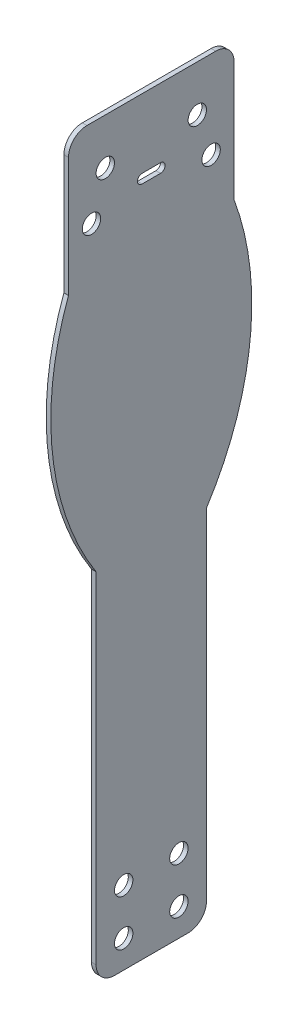
ISO-10303-21;
HEADER;
FILE_DESCRIPTION(('STEP AP214'),'2;1');
FILE_NAME('part.step','',(''),(''),'','','');
FILE_SCHEMA(('AUTOMOTIVE_DESIGN { 1 0 10303 214 1 1 1 1 }'));
ENDSEC;
DATA;
#1=APPLICATION_CONTEXT('core data for automotive mechanical design processes');
#2=APPLICATION_PROTOCOL_DEFINITION('international standard','automotive_design',2000,#1);
#3=PRODUCT_CONTEXT('',#1,'mechanical');
#4=PRODUCT('Part','Part','',(#3));
#5=PRODUCT_RELATED_PRODUCT_CATEGORY('part','',(#4));
#6=PRODUCT_DEFINITION_FORMATION('','',#4);
#7=PRODUCT_DEFINITION_CONTEXT('part definition',#1,'design');
#8=PRODUCT_DEFINITION('design','',#6,#7);
#9=PRODUCT_DEFINITION_SHAPE('','',#8);
#10=(LENGTH_UNIT() NAMED_UNIT(*) SI_UNIT(.MILLI.,.METRE.));
#11=(NAMED_UNIT(*) PLANE_ANGLE_UNIT() SI_UNIT($,.RADIAN.));
#12=(NAMED_UNIT(*) SI_UNIT($,.STERADIAN.) SOLID_ANGLE_UNIT());
#13=UNCERTAINTY_MEASURE_WITH_UNIT(LENGTH_MEASURE(1.E-05),#10,'distance_accuracy_value','');
#14=(GEOMETRIC_REPRESENTATION_CONTEXT(3) GLOBAL_UNCERTAINTY_ASSIGNED_CONTEXT((#13)) GLOBAL_UNIT_ASSIGNED_CONTEXT((#10,
#11,#12)) REPRESENTATION_CONTEXT('',''));
#15=CARTESIAN_POINT('',(0.,0.,0.));
#16=DIRECTION('',(0.,0.,1.));
#17=DIRECTION('',(1.,0.,0.));
#18=AXIS2_PLACEMENT_3D('',#15,#16,#17);
#19=CARTESIAN_POINT('',(0.,-51.4826288706178,-40.1592353526703));
#20=DIRECTION('',(1.,0.,0.));
#21=DIRECTION('',(0.,0.,-1.));
#22=AXIS2_PLACEMENT_3D('',#19,#20,#21);
#23=PLANE('',#22);
#24=CARTESIAN_POINT('',(0.,-147.,-6.00000000000002));
#25=DIRECTION('',(1.,0.,0.));
#26=DIRECTION('',(0.,0.,-1.));
#27=AXIS2_PLACEMENT_3D('',#24,#25,#26);
#28=CIRCLE('',#27,2.);
#29=CARTESIAN_POINT('',(0.,-147.,-8.00000000000002));
#30=VERTEX_POINT('',#29);
#31=EDGE_CURVE('E630',#30,#30,#28,.T.);
#32=ORIENTED_EDGE('',*,*,#31,.T.);
#33=EDGE_LOOP('',(#32));
#34=FACE_BOUND('',#33,.T.);
#35=CARTESIAN_POINT('',(0.,-147.,5.99999999999998));
#36=DIRECTION('',(1.,0.,0.));
#37=DIRECTION('',(0.,0.,-1.));
#38=AXIS2_PLACEMENT_3D('',#35,#36,#37);
#39=CIRCLE('',#38,2.);
#40=CARTESIAN_POINT('',(0.,-147.,3.99999999999998));
#41=VERTEX_POINT('',#40);
#42=EDGE_CURVE('E626',#41,#41,#39,.T.);
#43=ORIENTED_EDGE('',*,*,#42,.T.);
#44=EDGE_LOOP('',(#43));
#45=FACE_BOUND('',#44,.T.);
#46=CARTESIAN_POINT('',(0.,-157.,5.99999999999998));
#47=DIRECTION('',(1.,0.,0.));
#48=DIRECTION('',(0.,0.,-1.));
#49=AXIS2_PLACEMENT_3D('',#46,#47,#48);
#50=CIRCLE('',#49,2.);
#51=CARTESIAN_POINT('',(0.,-157.,3.99999999999998));
#52=VERTEX_POINT('',#51);
#53=EDGE_CURVE('E619',#52,#52,#50,.T.);
#54=ORIENTED_EDGE('',*,*,#53,.T.);
#55=EDGE_LOOP('',(#54));
#56=FACE_BOUND('',#55,.T.);
#57=CARTESIAN_POINT('',(0.,-157.,-6.00000000000002));
#58=DIRECTION('',(1.,0.,0.));
#59=DIRECTION('',(0.,0.,-1.));
#60=AXIS2_PLACEMENT_3D('',#57,#58,#59);
#61=CIRCLE('',#60,2.);
#62=CARTESIAN_POINT('',(0.,-157.,-8.00000000000002));
#63=VERTEX_POINT('',#62);
#64=EDGE_CURVE('E181',#63,#63,#61,.T.);
#65=ORIENTED_EDGE('',*,*,#64,.T.);
#66=EDGE_LOOP('',(#65));
#67=FACE_BOUND('',#66,.T.);
#68=DIRECTION('',(0.,0.,1.));
#69=VECTOR('',#68,1.);
#70=CARTESIAN_POINT('',(0.,-15.,2.));
#71=LINE('',#70,#69);
#72=CARTESIAN_POINT('',(0.,-15.,-2.));
#73=VERTEX_POINT('',#72);
#74=CARTESIAN_POINT('',(0.,-15.,2.));
#75=VERTEX_POINT('',#74);
#76=EDGE_CURVE('E163',#73,#75,#71,.T.);
#77=ORIENTED_EDGE('',*,*,#76,.T.);
#78=CARTESIAN_POINT('',(0.,-16.,2.));
#79=DIRECTION('',(1.,0.,0.));
#80=DIRECTION('',(0.,0.,-1.));
#81=AXIS2_PLACEMENT_3D('',#78,#79,#80);
#82=CIRCLE('',#81,1.);
#83=CARTESIAN_POINT('',(0.,-17.,2.));
#84=VERTEX_POINT('',#83);
#85=EDGE_CURVE('E155',#75,#84,#82,.T.);
#86=ORIENTED_EDGE('',*,*,#85,.T.);
#87=DIRECTION('',(0.,0.,-1.));
#88=VECTOR('',#87,1.);
#89=CARTESIAN_POINT('',(0.,-17.,2.));
#90=LINE('',#89,#88);
#91=CARTESIAN_POINT('',(0.,-17.,-2.));
#92=VERTEX_POINT('',#91);
#93=EDGE_CURVE('E167',#84,#92,#90,.T.);
#94=ORIENTED_EDGE('',*,*,#93,.T.);
#95=CARTESIAN_POINT('',(0.,-16.,-2.));
#96=DIRECTION('',(1.,0.,0.));
#97=DIRECTION('',(0.,0.,-1.));
#98=AXIS2_PLACEMENT_3D('',#95,#96,#97);
#99=CIRCLE('',#98,1.);
#100=EDGE_CURVE('E171',#92,#73,#99,.T.);
#101=ORIENTED_EDGE('',*,*,#100,.T.);
#102=EDGE_LOOP('',(#77,#86,#94,#101));
#103=FACE_BOUND('',#102,.T.);
#104=CARTESIAN_POINT('',(0.,-19.,13.));
#105=DIRECTION('',(-1.,0.,0.));
#106=DIRECTION('',(0.,0.,1.));
#107=AXIS2_PLACEMENT_3D('',#104,#105,#106);
#108=CIRCLE('',#107,2.);
#109=CARTESIAN_POINT('',(0.,-19.,15.));
#110=VERTEX_POINT('',#109);
#111=EDGE_CURVE('E202',#110,#110,#108,.T.);
#112=ORIENTED_EDGE('',*,*,#111,.F.);
#113=EDGE_LOOP('',(#112));
#114=FACE_BOUND('',#113,.T.);
#115=CARTESIAN_POINT('',(0.,-10.,10.));
#116=DIRECTION('',(-1.,0.,0.));
#117=DIRECTION('',(0.,0.,1.));
#118=AXIS2_PLACEMENT_3D('',#115,#116,#117);
#119=CIRCLE('',#118,2.);
#120=CARTESIAN_POINT('',(0.,-10.,12.));
#121=VERTEX_POINT('',#120);
#122=EDGE_CURVE('E208',#121,#121,#119,.T.);
#123=ORIENTED_EDGE('',*,*,#122,.F.);
#124=EDGE_LOOP('',(#123));
#125=FACE_BOUND('',#124,.T.);
#126=CARTESIAN_POINT('',(0.,-10.,-10.));
#127=DIRECTION('',(-1.,0.,0.));
#128=DIRECTION('',(0.,0.,1.));
#129=AXIS2_PLACEMENT_3D('',#126,#127,#128);
#130=CIRCLE('',#129,2.);
#131=CARTESIAN_POINT('',(0.,-10.,-8.));
#132=VERTEX_POINT('',#131);
#133=EDGE_CURVE('E214',#132,#132,#130,.T.);
#134=ORIENTED_EDGE('',*,*,#133,.F.);
#135=EDGE_LOOP('',(#134));
#136=FACE_BOUND('',#135,.T.);
#137=DIRECTION('',(0.,-1.,0.));
#138=VECTOR('',#137,1.);
#139=CARTESIAN_POINT('',(0.,0.,18.));
#140=LINE('',#139,#138);
#141=CARTESIAN_POINT('',(0.,-3.99999999999999,18.));
#142=VERTEX_POINT('',#141);
#143=CARTESIAN_POINT('',(0.,-30.,18.));
#144=VERTEX_POINT('',#143);
#145=EDGE_CURVE('E220',#142,#144,#140,.T.);
#146=ORIENTED_EDGE('',*,*,#145,.F.);
#147=CARTESIAN_POINT('',(0.,-4.,14.));
#148=DIRECTION('',(1.,0.,0.));
#149=DIRECTION('',(0.,0.,-1.));
#150=AXIS2_PLACEMENT_3D('',#147,#148,#149);
#151=CIRCLE('',#150,4.);
#152=CARTESIAN_POINT('',(0.,0.,14.));
#153=VERTEX_POINT('',#152);
#154=EDGE_CURVE('E281',#142,#153,#151,.F.);
#155=ORIENTED_EDGE('',*,*,#154,.T.);
#156=DIRECTION('',(0.,0.,-1.));
#157=VECTOR('',#156,1.);
#158=CARTESIAN_POINT('',(0.,0.,18.));
#159=LINE('',#158,#157);
#160=CARTESIAN_POINT('',(0.,0.,-14.));
#161=VERTEX_POINT('',#160);
#162=EDGE_CURVE('E224',#153,#161,#159,.T.);
#163=ORIENTED_EDGE('',*,*,#162,.T.);
#164=CARTESIAN_POINT('',(0.,-3.99999999999999,-14.));
#165=DIRECTION('',(1.,0.,0.));
#166=DIRECTION('',(0.,0.,-1.));
#167=AXIS2_PLACEMENT_3D('',#164,#165,#166);
#168=CIRCLE('',#167,4.);
#169=CARTESIAN_POINT('',(0.,-4.,-18.));
#170=VERTEX_POINT('',#169);
#171=EDGE_CURVE('E279',#161,#170,#168,.F.);
#172=ORIENTED_EDGE('',*,*,#171,.T.);
#173=DIRECTION('',(0.,-1.,0.));
#174=VECTOR('',#173,1.);
#175=CARTESIAN_POINT('',(0.,0.,-18.));
#176=LINE('',#175,#174);
#177=CARTESIAN_POINT('',(0.,-30.,-18.));
#178=VERTEX_POINT('',#177);
#179=EDGE_CURVE('E257',#170,#178,#176,.T.);
#180=ORIENTED_EDGE('',*,*,#179,.T.);
#181=CARTESIAN_POINT('',(0.,-51.4826288706178,40.1592353526703));
#182=DIRECTION('',(-1.,0.,0.));
#183=DIRECTION('',(0.,0.,1.));
#184=AXIS2_PLACEMENT_3D('',#181,#182,#183);
#185=CIRCLE('',#184,62.);
#186=CARTESIAN_POINT('',(0.,-85.,-12.));
#187=VERTEX_POINT('',#186);
#188=EDGE_CURVE('E254',#178,#187,#185,.T.);
#189=ORIENTED_EDGE('',*,*,#188,.T.);
#190=DIRECTION('',(0.,1.,0.));
#191=VECTOR('',#190,1.);
#192=CARTESIAN_POINT('',(0.,-163.,-12.));
#193=LINE('',#192,#191);
#194=CARTESIAN_POINT('',(0.,-159.,-12.));
#195=VERTEX_POINT('',#194);
#196=EDGE_CURVE('E252',#195,#187,#193,.T.);
#197=ORIENTED_EDGE('',*,*,#196,.F.);
#198=CARTESIAN_POINT('',(0.,-159.,-8.));
#199=DIRECTION('',(1.,0.,0.));
#200=DIRECTION('',(0.,0.,-1.));
#201=AXIS2_PLACEMENT_3D('',#198,#199,#200);
#202=CIRCLE('',#201,4.);
#203=CARTESIAN_POINT('',(0.,-163.,-8.));
#204=VERTEX_POINT('',#203);
#205=EDGE_CURVE('E277',#195,#204,#202,.F.);
#206=ORIENTED_EDGE('',*,*,#205,.T.);
#207=DIRECTION('',(0.,0.,1.));
#208=VECTOR('',#207,1.);
#209=CARTESIAN_POINT('',(0.,-163.,-12.));
#210=LINE('',#209,#208);
#211=CARTESIAN_POINT('',(0.,-163.,8.));
#212=VERTEX_POINT('',#211);
#213=EDGE_CURVE('E249',#204,#212,#210,.T.);
#214=ORIENTED_EDGE('',*,*,#213,.T.);
#215=CARTESIAN_POINT('',(0.,-159.,8.));
#216=DIRECTION('',(1.,0.,0.));
#217=DIRECTION('',(0.,0.,-1.));
#218=AXIS2_PLACEMENT_3D('',#215,#216,#217);
#219=CIRCLE('',#218,4.);
#220=CARTESIAN_POINT('',(0.,-159.,12.));
#221=VERTEX_POINT('',#220);
#222=EDGE_CURVE('E275',#212,#221,#219,.F.);
#223=ORIENTED_EDGE('',*,*,#222,.T.);
#224=DIRECTION('',(0.,1.,0.));
#225=VECTOR('',#224,1.);
#226=CARTESIAN_POINT('',(0.,-163.,12.));
#227=LINE('',#226,#225);
#228=CARTESIAN_POINT('',(0.,-85.,12.));
#229=VERTEX_POINT('',#228);
#230=EDGE_CURVE('E247',#221,#229,#227,.T.);
#231=ORIENTED_EDGE('',*,*,#230,.T.);
#232=CARTESIAN_POINT('',(0.,-51.4826288706178,-40.1592353526703));
#233=DIRECTION('',(1.,0.,0.));
#234=DIRECTION('',(0.,0.,-1.));
#235=AXIS2_PLACEMENT_3D('',#232,#233,#234);
#236=CIRCLE('',#235,62.);
#237=EDGE_CURVE('E244',#144,#229,#236,.T.);
#238=ORIENTED_EDGE('',*,*,#237,.F.);
#239=EDGE_LOOP('',(#146,#155,#163,#172,#180,#189,#197,#206,#214,#223,#231,#238));
#240=FACE_BOUND('',#239,.T.);
#241=CARTESIAN_POINT('',(0.,-19.,-13.));
#242=DIRECTION('',(-1.,0.,0.));
#243=DIRECTION('',(0.,0.,1.));
#244=AXIS2_PLACEMENT_3D('',#241,#242,#243);
#245=CIRCLE('',#244,2.);
#246=CARTESIAN_POINT('',(0.,-19.,-11.));
#247=VERTEX_POINT('',#246);
#248=EDGE_CURVE('E193',#247,#247,#245,.T.);
#249=ORIENTED_EDGE('',*,*,#248,.F.);
#250=EDGE_LOOP('',(#249));
#251=FACE_BOUND('',#250,.T.);
#252=ADVANCED_FACE('F37',(#34,#45,#56,#67,#103,#114,#125,#136,#240,#251),#23,.F.);
#253=CARTESIAN_POINT('',(1.,0.,18.));
#254=DIRECTION('',(0.,0.,-1.));
#255=DIRECTION('',(0.,1.,0.));
#256=AXIS2_PLACEMENT_3D('',#253,#254,#255);
#257=PLANE('',#256);
#258=DIRECTION('',(0.,-1.,0.));
#259=VECTOR('',#258,1.);
#260=CARTESIAN_POINT('',(1.,0.,18.));
#261=LINE('',#260,#259);
#262=CARTESIAN_POINT('',(1.,-3.99999999999999,18.));
#263=VERTEX_POINT('',#262);
#264=CARTESIAN_POINT('',(1.,-30.,18.));
#265=VERTEX_POINT('',#264);
#266=EDGE_CURVE('E221',#263,#265,#261,.T.);
#267=ORIENTED_EDGE('',*,*,#266,.F.);
#268=DIRECTION('',(-1.,0.,0.));
#269=VECTOR('',#268,1.);
#270=CARTESIAN_POINT('',(0.,-3.99999999999999,18.));
#271=LINE('',#270,#269);
#272=EDGE_CURVE('E272',#263,#142,#271,.T.);
#273=ORIENTED_EDGE('',*,*,#272,.T.);
#274=ORIENTED_EDGE('',*,*,#145,.T.);
#275=DIRECTION('',(-1.,0.,0.));
#276=VECTOR('',#275,1.);
#277=CARTESIAN_POINT('',(1.,-30.,18.));
#278=LINE('',#277,#276);
#279=EDGE_CURVE('E269',#265,#144,#278,.T.);
#280=ORIENTED_EDGE('',*,*,#279,.F.);
#281=EDGE_LOOP('',(#267,#273,#274,#280));
#282=FACE_BOUND('',#281,.T.);
#283=ADVANCED_FACE('F340',(#282),#257,.F.);
#284=CARTESIAN_POINT('',(1.,-51.4826288706178,-40.1592353526703));
#285=DIRECTION('',(-1.,0.,0.));
#286=DIRECTION('',(0.,0.,1.));
#287=AXIS2_PLACEMENT_3D('',#284,#285,#286);
#288=CYLINDRICAL_SURFACE('',#287,62.);
#289=ORIENTED_EDGE('',*,*,#237,.T.);
#290=DIRECTION('',(-1.,0.,0.));
#291=VECTOR('',#290,1.);
#292=CARTESIAN_POINT('',(1.,-85.,12.));
#293=LINE('',#292,#291);
#294=CARTESIAN_POINT('',(1.,-85.,12.));
#295=VERTEX_POINT('',#294);
#296=EDGE_CURVE('E266',#295,#229,#293,.T.);
#297=ORIENTED_EDGE('',*,*,#296,.F.);
#298=CARTESIAN_POINT('',(1.,-51.4826288706178,-40.1592353526703));
#299=DIRECTION('',(1.,0.,0.));
#300=DIRECTION('',(0.,0.,-1.));
#301=AXIS2_PLACEMENT_3D('',#298,#299,#300);
#302=CIRCLE('',#301,62.);
#303=EDGE_CURVE('E223',#265,#295,#302,.T.);
#304=ORIENTED_EDGE('',*,*,#303,.F.);
#305=ORIENTED_EDGE('',*,*,#279,.T.);
#306=EDGE_LOOP('',(#289,#297,#304,#305));
#307=FACE_BOUND('',#306,.T.);
#308=ADVANCED_FACE('F345',(#307),#288,.T.);
#309=CARTESIAN_POINT('',(1.,-163.,12.));
#310=DIRECTION('',(0.,0.,1.));
#311=DIRECTION('',(1.,0.,0.));
#312=AXIS2_PLACEMENT_3D('',#309,#310,#311);
#313=PLANE('',#312);
#314=ORIENTED_EDGE('',*,*,#230,.F.);
#315=DIRECTION('',(-1.,0.,0.));
#316=VECTOR('',#315,1.);
#317=CARTESIAN_POINT('',(1.,-159.,12.));
#318=LINE('',#317,#316);
#319=CARTESIAN_POINT('',(1.,-159.,12.));
#320=VERTEX_POINT('',#319);
#321=EDGE_CURVE('E11',#221,#320,#318,.F.);
#322=ORIENTED_EDGE('',*,*,#321,.T.);
#323=DIRECTION('',(0.,1.,0.));
#324=VECTOR('',#323,1.);
#325=CARTESIAN_POINT('',(1.,-163.,12.));
#326=LINE('',#325,#324);
#327=EDGE_CURVE('E227',#320,#295,#326,.T.);
#328=ORIENTED_EDGE('',*,*,#327,.T.);
#329=ORIENTED_EDGE('',*,*,#296,.T.);
#330=EDGE_LOOP('',(#314,#322,#328,#329));
#331=FACE_BOUND('',#330,.T.);
#332=ADVANCED_FACE('F348',(#331),#313,.T.);
#333=CARTESIAN_POINT('',(1.,-163.,-12.));
#334=DIRECTION('',(0.,-1.,0.));
#335=DIRECTION('',(0.,0.,-1.));
#336=AXIS2_PLACEMENT_3D('',#333,#334,#335);
#337=PLANE('',#336);
#338=ORIENTED_EDGE('',*,*,#213,.F.);
#339=DIRECTION('',(-1.,0.,0.));
#340=VECTOR('',#339,1.);
#341=CARTESIAN_POINT('',(1.,-163.,-8.));
#342=LINE('',#341,#340);
#343=CARTESIAN_POINT('',(1.,-163.,-8.));
#344=VERTEX_POINT('',#343);
#345=EDGE_CURVE('E45',#204,#344,#342,.F.);
#346=ORIENTED_EDGE('',*,*,#345,.T.);
#347=DIRECTION('',(0.,0.,1.));
#348=VECTOR('',#347,1.);
#349=CARTESIAN_POINT('',(1.,-163.,-12.));
#350=LINE('',#349,#348);
#351=CARTESIAN_POINT('',(1.,-163.,8.));
#352=VERTEX_POINT('',#351);
#353=EDGE_CURVE('E229',#344,#352,#350,.T.);
#354=ORIENTED_EDGE('',*,*,#353,.T.);
#355=DIRECTION('',(-1.,0.,0.));
#356=VECTOR('',#355,1.);
#357=CARTESIAN_POINT('',(1.,-163.,8.));
#358=LINE('',#357,#356);
#359=EDGE_CURVE('E299',#352,#212,#358,.T.);
#360=ORIENTED_EDGE('',*,*,#359,.T.);
#361=EDGE_LOOP('',(#338,#346,#354,#360));
#362=FACE_BOUND('',#361,.T.);
#363=ADVANCED_FACE('F304',(#362),#337,.T.);
#364=CARTESIAN_POINT('',(1.,-163.,-12.));
#365=DIRECTION('',(0.,0.,1.));
#366=DIRECTION('',(1.,0.,0.));
#367=AXIS2_PLACEMENT_3D('',#364,#365,#366);
#368=PLANE('',#367);
#369=DIRECTION('',(0.,1.,0.));
#370=VECTOR('',#369,1.);
#371=CARTESIAN_POINT('',(1.,-163.,-12.));
#372=LINE('',#371,#370);
#373=CARTESIAN_POINT('',(1.,-159.,-12.));
#374=VERTEX_POINT('',#373);
#375=CARTESIAN_POINT('',(1.,-85.,-12.));
#376=VERTEX_POINT('',#375);
#377=EDGE_CURVE('E232',#374,#376,#372,.T.);
#378=ORIENTED_EDGE('',*,*,#377,.F.);
#379=DIRECTION('',(-1.,0.,0.));
#380=VECTOR('',#379,1.);
#381=CARTESIAN_POINT('',(0.,-159.,-12.));
#382=LINE('',#381,#380);
#383=EDGE_CURVE('E296',#374,#195,#382,.T.);
#384=ORIENTED_EDGE('',*,*,#383,.T.);
#385=ORIENTED_EDGE('',*,*,#196,.T.);
#386=DIRECTION('',(-1.,0.,0.));
#387=VECTOR('',#386,1.);
#388=CARTESIAN_POINT('',(1.,-85.,-12.));
#389=LINE('',#388,#387);
#390=EDGE_CURVE('E263',#376,#187,#389,.T.);
#391=ORIENTED_EDGE('',*,*,#390,.F.);
#392=EDGE_LOOP('',(#378,#384,#385,#391));
#393=FACE_BOUND('',#392,.T.);
#394=ADVANCED_FACE('F315',(#393),#368,.F.);
#395=CARTESIAN_POINT('',(1.,-51.4826288706178,40.1592353526703));
#396=DIRECTION('',(-1.,0.,0.));
#397=DIRECTION('',(0.,0.,1.));
#398=AXIS2_PLACEMENT_3D('',#395,#396,#397);
#399=CYLINDRICAL_SURFACE('',#398,62.);
#400=ORIENTED_EDGE('',*,*,#188,.F.);
#401=DIRECTION('',(-1.,0.,0.));
#402=VECTOR('',#401,1.);
#403=CARTESIAN_POINT('',(1.,-30.,-18.));
#404=LINE('',#403,#402);
#405=CARTESIAN_POINT('',(1.,-30.,-18.));
#406=VERTEX_POINT('',#405);
#407=EDGE_CURVE('E242',#406,#178,#404,.T.);
#408=ORIENTED_EDGE('',*,*,#407,.F.);
#409=CARTESIAN_POINT('',(1.,-51.4826288706178,40.1592353526703));
#410=DIRECTION('',(-1.,0.,0.));
#411=DIRECTION('',(0.,0.,1.));
#412=AXIS2_PLACEMENT_3D('',#409,#410,#411);
#413=CIRCLE('',#412,62.);
#414=EDGE_CURVE('E234',#406,#376,#413,.T.);
#415=ORIENTED_EDGE('',*,*,#414,.T.);
#416=ORIENTED_EDGE('',*,*,#390,.T.);
#417=EDGE_LOOP('',(#400,#408,#415,#416));
#418=FACE_BOUND('',#417,.T.);
#419=ADVANCED_FACE('F323',(#418),#399,.T.);
#420=CARTESIAN_POINT('',(1.,0.,-18.));
#421=DIRECTION('',(0.,0.,-1.));
#422=DIRECTION('',(0.,1.,0.));
#423=AXIS2_PLACEMENT_3D('',#420,#421,#422);
#424=PLANE('',#423);
#425=ORIENTED_EDGE('',*,*,#179,.F.);
#426=DIRECTION('',(-1.,0.,0.));
#427=VECTOR('',#426,1.);
#428=CARTESIAN_POINT('',(1.,-4.,-18.));
#429=LINE('',#428,#427);
#430=CARTESIAN_POINT('',(1.,-4.,-18.));
#431=VERTEX_POINT('',#430);
#432=EDGE_CURVE('E52',#170,#431,#429,.F.);
#433=ORIENTED_EDGE('',*,*,#432,.T.);
#434=DIRECTION('',(0.,-1.,0.));
#435=VECTOR('',#434,1.);
#436=CARTESIAN_POINT('',(1.,0.,-18.));
#437=LINE('',#436,#435);
#438=EDGE_CURVE('E237',#431,#406,#437,.T.);
#439=ORIENTED_EDGE('',*,*,#438,.T.);
#440=ORIENTED_EDGE('',*,*,#407,.T.);
#441=EDGE_LOOP('',(#425,#433,#439,#440));
#442=FACE_BOUND('',#441,.T.);
#443=ADVANCED_FACE('F369',(#442),#424,.T.);
#444=CARTESIAN_POINT('',(1.,0.,18.));
#445=DIRECTION('',(0.,1.,0.));
#446=DIRECTION('',(0.,0.,1.));
#447=AXIS2_PLACEMENT_3D('',#444,#445,#446);
#448=PLANE('',#447);
#449=ORIENTED_EDGE('',*,*,#162,.F.);
#450=DIRECTION('',(-1.,0.,0.));
#451=VECTOR('',#450,1.);
#452=CARTESIAN_POINT('',(1.,0.,14.));
#453=LINE('',#452,#451);
#454=CARTESIAN_POINT('',(1.,0.,14.));
#455=VERTEX_POINT('',#454);
#456=EDGE_CURVE('E286',#153,#455,#453,.F.);
#457=ORIENTED_EDGE('',*,*,#456,.T.);
#458=DIRECTION('',(0.,0.,-1.));
#459=VECTOR('',#458,1.);
#460=CARTESIAN_POINT('',(1.,0.,18.));
#461=LINE('',#460,#459);
#462=CARTESIAN_POINT('',(1.,0.,-14.));
#463=VERTEX_POINT('',#462);
#464=EDGE_CURVE('E239',#455,#463,#461,.T.);
#465=ORIENTED_EDGE('',*,*,#464,.T.);
#466=DIRECTION('',(-1.,0.,0.));
#467=VECTOR('',#466,1.);
#468=CARTESIAN_POINT('',(1.,0.,-14.));
#469=LINE('',#468,#467);
#470=EDGE_CURVE('E283',#463,#161,#469,.T.);
#471=ORIENTED_EDGE('',*,*,#470,.T.);
#472=EDGE_LOOP('',(#449,#457,#465,#471));
#473=FACE_BOUND('',#472,.T.);
#474=ADVANCED_FACE('F331',(#473),#448,.T.);
#475=CARTESIAN_POINT('',(1.,-51.4826288706178,-40.1592353526703));
#476=DIRECTION('',(1.,0.,0.));
#477=DIRECTION('',(0.,0.,-1.));
#478=AXIS2_PLACEMENT_3D('',#475,#476,#477);
#479=PLANE('',#478);
#480=CARTESIAN_POINT('',(1.,-147.,-6.00000000000002));
#481=DIRECTION('',(1.,0.,0.));
#482=DIRECTION('',(0.,0.,-1.));
#483=AXIS2_PLACEMENT_3D('',#480,#481,#482);
#484=CIRCLE('',#483,2.);
#485=CARTESIAN_POINT('',(1.,-147.,-8.00000000000002));
#486=VERTEX_POINT('',#485);
#487=EDGE_CURVE('E585',#486,#486,#484,.T.);
#488=ORIENTED_EDGE('',*,*,#487,.F.);
#489=EDGE_LOOP('',(#488));
#490=FACE_BOUND('',#489,.T.);
#491=CARTESIAN_POINT('',(1.,-147.,5.99999999999998));
#492=DIRECTION('',(1.,0.,0.));
#493=DIRECTION('',(0.,0.,-1.));
#494=AXIS2_PLACEMENT_3D('',#491,#492,#493);
#495=CIRCLE('',#494,2.);
#496=CARTESIAN_POINT('',(1.,-147.,3.99999999999998));
#497=VERTEX_POINT('',#496);
#498=EDGE_CURVE('E589',#497,#497,#495,.T.);
#499=ORIENTED_EDGE('',*,*,#498,.F.);
#500=EDGE_LOOP('',(#499));
#501=FACE_BOUND('',#500,.T.);
#502=CARTESIAN_POINT('',(1.,-157.,5.99999999999998));
#503=DIRECTION('',(1.,0.,0.));
#504=DIRECTION('',(0.,0.,-1.));
#505=AXIS2_PLACEMENT_3D('',#502,#503,#504);
#506=CIRCLE('',#505,2.);
#507=CARTESIAN_POINT('',(1.,-157.,3.99999999999998));
#508=VERTEX_POINT('',#507);
#509=EDGE_CURVE('E593',#508,#508,#506,.T.);
#510=ORIENTED_EDGE('',*,*,#509,.F.);
#511=EDGE_LOOP('',(#510));
#512=FACE_BOUND('',#511,.T.);
#513=CARTESIAN_POINT('',(1.,-157.,-6.00000000000002));
#514=DIRECTION('',(1.,0.,0.));
#515=DIRECTION('',(0.,0.,-1.));
#516=AXIS2_PLACEMENT_3D('',#513,#514,#515);
#517=CIRCLE('',#516,2.);
#518=CARTESIAN_POINT('',(1.,-157.,-8.00000000000002));
#519=VERTEX_POINT('',#518);
#520=EDGE_CURVE('E597',#519,#519,#517,.T.);
#521=ORIENTED_EDGE('',*,*,#520,.F.);
#522=EDGE_LOOP('',(#521));
#523=FACE_BOUND('',#522,.T.);
#524=CARTESIAN_POINT('',(1.,-16.,2.));
#525=DIRECTION('',(1.,0.,0.));
#526=DIRECTION('',(0.,0.,-1.));
#527=AXIS2_PLACEMENT_3D('',#524,#525,#526);
#528=CIRCLE('',#527,1.);
#529=CARTESIAN_POINT('',(1.,-15.,2.));
#530=VERTEX_POINT('',#529);
#531=CARTESIAN_POINT('',(1.,-17.,2.));
#532=VERTEX_POINT('',#531);
#533=EDGE_CURVE('E158',#530,#532,#528,.T.);
#534=ORIENTED_EDGE('',*,*,#533,.F.);
#535=DIRECTION('',(0.,0.,1.));
#536=VECTOR('',#535,1.);
#537=CARTESIAN_POINT('',(1.,-15.,2.));
#538=LINE('',#537,#536);
#539=CARTESIAN_POINT('',(1.,-15.,-2.));
#540=VERTEX_POINT('',#539);
#541=EDGE_CURVE('E175',#540,#530,#538,.T.);
#542=ORIENTED_EDGE('',*,*,#541,.F.);
#543=CARTESIAN_POINT('',(1.,-16.,-2.));
#544=DIRECTION('',(1.,0.,0.));
#545=DIRECTION('',(0.,0.,-1.));
#546=AXIS2_PLACEMENT_3D('',#543,#544,#545);
#547=CIRCLE('',#546,1.);
#548=CARTESIAN_POINT('',(1.,-17.,-2.));
#549=VERTEX_POINT('',#548);
#550=EDGE_CURVE('E178',#549,#540,#547,.T.);
#551=ORIENTED_EDGE('',*,*,#550,.F.);
#552=DIRECTION('',(0.,0.,-1.));
#553=VECTOR('',#552,1.);
#554=CARTESIAN_POINT('',(1.,-17.,2.));
#555=LINE('',#554,#553);
#556=EDGE_CURVE('E187',#532,#549,#555,.T.);
#557=ORIENTED_EDGE('',*,*,#556,.F.);
#558=EDGE_LOOP('',(#534,#542,#551,#557));
#559=FACE_BOUND('',#558,.T.);
#560=CARTESIAN_POINT('',(1.,-19.,-13.));
#561=DIRECTION('',(-1.,0.,0.));
#562=DIRECTION('',(0.,0.,1.));
#563=AXIS2_PLACEMENT_3D('',#560,#561,#562);
#564=CIRCLE('',#563,2.);
#565=CARTESIAN_POINT('',(1.,-19.,-11.));
#566=VERTEX_POINT('',#565);
#567=EDGE_CURVE('E199',#566,#566,#564,.T.);
#568=ORIENTED_EDGE('',*,*,#567,.T.);
#569=EDGE_LOOP('',(#568));
#570=FACE_BOUND('',#569,.T.);
#571=CARTESIAN_POINT('',(1.,-19.,13.));
#572=DIRECTION('',(-1.,0.,0.));
#573=DIRECTION('',(0.,0.,1.));
#574=AXIS2_PLACEMENT_3D('',#571,#572,#573);
#575=CIRCLE('',#574,2.);
#576=CARTESIAN_POINT('',(1.,-19.,15.));
#577=VERTEX_POINT('',#576);
#578=EDGE_CURVE('E205',#577,#577,#575,.T.);
#579=ORIENTED_EDGE('',*,*,#578,.T.);
#580=EDGE_LOOP('',(#579));
#581=FACE_BOUND('',#580,.T.);
#582=CARTESIAN_POINT('',(1.,-10.,10.));
#583=DIRECTION('',(-1.,0.,0.));
#584=DIRECTION('',(0.,0.,1.));
#585=AXIS2_PLACEMENT_3D('',#582,#583,#584);
#586=CIRCLE('',#585,2.);
#587=CARTESIAN_POINT('',(1.,-10.,12.));
#588=VERTEX_POINT('',#587);
#589=EDGE_CURVE('E211',#588,#588,#586,.T.);
#590=ORIENTED_EDGE('',*,*,#589,.T.);
#591=EDGE_LOOP('',(#590));
#592=FACE_BOUND('',#591,.T.);
#593=CARTESIAN_POINT('',(1.,-10.,-10.));
#594=DIRECTION('',(-1.,0.,0.));
#595=DIRECTION('',(0.,0.,1.));
#596=AXIS2_PLACEMENT_3D('',#593,#594,#595);
#597=CIRCLE('',#596,2.);
#598=CARTESIAN_POINT('',(1.,-10.,-8.));
#599=VERTEX_POINT('',#598);
#600=EDGE_CURVE('E217',#599,#599,#597,.T.);
#601=ORIENTED_EDGE('',*,*,#600,.T.);
#602=EDGE_LOOP('',(#601));
#603=FACE_BOUND('',#602,.T.);
#604=ORIENTED_EDGE('',*,*,#464,.F.);
#605=CARTESIAN_POINT('',(1.,-4.,14.));
#606=DIRECTION('',(1.,0.,0.));
#607=DIRECTION('',(0.,0.,-1.));
#608=AXIS2_PLACEMENT_3D('',#605,#606,#607);
#609=CIRCLE('',#608,4.);
#610=EDGE_CURVE('E293',#455,#263,#609,.T.);
#611=ORIENTED_EDGE('',*,*,#610,.T.);
#612=ORIENTED_EDGE('',*,*,#266,.T.);
#613=ORIENTED_EDGE('',*,*,#303,.T.);
#614=ORIENTED_EDGE('',*,*,#327,.F.);
#615=CARTESIAN_POINT('',(1.,-159.,8.));
#616=DIRECTION('',(1.,0.,0.));
#617=DIRECTION('',(0.,0.,-1.));
#618=AXIS2_PLACEMENT_3D('',#615,#616,#617);
#619=CIRCLE('',#618,4.);
#620=EDGE_CURVE('E288',#320,#352,#619,.T.);
#621=ORIENTED_EDGE('',*,*,#620,.T.);
#622=ORIENTED_EDGE('',*,*,#353,.F.);
#623=CARTESIAN_POINT('',(1.,-159.,-8.));
#624=DIRECTION('',(1.,0.,0.));
#625=DIRECTION('',(0.,0.,-1.));
#626=AXIS2_PLACEMENT_3D('',#623,#624,#625);
#627=CIRCLE('',#626,4.);
#628=EDGE_CURVE('E60',#344,#374,#627,.T.);
#629=ORIENTED_EDGE('',*,*,#628,.T.);
#630=ORIENTED_EDGE('',*,*,#377,.T.);
#631=ORIENTED_EDGE('',*,*,#414,.F.);
#632=ORIENTED_EDGE('',*,*,#438,.F.);
#633=CARTESIAN_POINT('',(1.,-3.99999999999999,-14.));
#634=DIRECTION('',(1.,0.,0.));
#635=DIRECTION('',(0.,0.,-1.));
#636=AXIS2_PLACEMENT_3D('',#633,#634,#635);
#637=CIRCLE('',#636,4.);
#638=EDGE_CURVE('E291',#431,#463,#637,.T.);
#639=ORIENTED_EDGE('',*,*,#638,.T.);
#640=EDGE_LOOP('',(#604,#611,#612,#613,#614,#621,#622,#629,#630,#631,#632,#639));
#641=FACE_BOUND('',#640,.T.);
#642=ADVANCED_FACE('F308',(#490,#501,#512,#523,#559,#570,#581,#592,#603,#641),#479,.T.);
#643=CARTESIAN_POINT('',(0.,-10.,-10.));
#644=DIRECTION('',(-1.,0.,0.));
#645=DIRECTION('',(0.,0.,1.));
#646=AXIS2_PLACEMENT_3D('',#643,#644,#645);
#647=CYLINDRICAL_SURFACE('',#646,2.);
#648=ORIENTED_EDGE('',*,*,#600,.F.);
#649=EDGE_LOOP('',(#648));
#650=FACE_BOUND('',#649,.T.);
#651=ORIENTED_EDGE('',*,*,#133,.T.);
#652=EDGE_LOOP('',(#651));
#653=FACE_BOUND('',#652,.T.);
#654=ADVANCED_FACE('F506',(#650,#653),#647,.F.);
#655=CARTESIAN_POINT('',(0.,-10.,10.));
#656=DIRECTION('',(-1.,0.,0.));
#657=DIRECTION('',(0.,0.,1.));
#658=AXIS2_PLACEMENT_3D('',#655,#656,#657);
#659=CYLINDRICAL_SURFACE('',#658,2.);
#660=ORIENTED_EDGE('',*,*,#589,.F.);
#661=EDGE_LOOP('',(#660));
#662=FACE_BOUND('',#661,.T.);
#663=ORIENTED_EDGE('',*,*,#122,.T.);
#664=EDGE_LOOP('',(#663));
#665=FACE_BOUND('',#664,.T.);
#666=ADVANCED_FACE('F492',(#662,#665),#659,.F.);
#667=CARTESIAN_POINT('',(0.,-19.,13.));
#668=DIRECTION('',(-1.,0.,0.));
#669=DIRECTION('',(0.,0.,1.));
#670=AXIS2_PLACEMENT_3D('',#667,#668,#669);
#671=CYLINDRICAL_SURFACE('',#670,2.);
#672=ORIENTED_EDGE('',*,*,#578,.F.);
#673=EDGE_LOOP('',(#672));
#674=FACE_BOUND('',#673,.T.);
#675=ORIENTED_EDGE('',*,*,#111,.T.);
#676=EDGE_LOOP('',(#675));
#677=FACE_BOUND('',#676,.T.);
#678=ADVANCED_FACE('F483',(#674,#677),#671,.F.);
#679=CARTESIAN_POINT('',(0.,-19.,-13.));
#680=DIRECTION('',(-1.,0.,0.));
#681=DIRECTION('',(0.,0.,1.));
#682=AXIS2_PLACEMENT_3D('',#679,#680,#681);
#683=CYLINDRICAL_SURFACE('',#682,2.);
#684=ORIENTED_EDGE('',*,*,#567,.F.);
#685=EDGE_LOOP('',(#684));
#686=FACE_BOUND('',#685,.T.);
#687=ORIENTED_EDGE('',*,*,#248,.T.);
#688=EDGE_LOOP('',(#687));
#689=FACE_BOUND('',#688,.T.);
#690=ADVANCED_FACE('F475',(#686,#689),#683,.F.);
#691=CARTESIAN_POINT('',(0.,-16.,2.));
#692=DIRECTION('',(1.,0.,0.));
#693=DIRECTION('',(0.,0.,-1.));
#694=AXIS2_PLACEMENT_3D('',#691,#692,#693);
#695=CYLINDRICAL_SURFACE('',#694,1.);
#696=ORIENTED_EDGE('',*,*,#533,.T.);
#697=DIRECTION('',(1.,0.,0.));
#698=VECTOR('',#697,1.);
#699=CARTESIAN_POINT('',(0.,-17.,2.));
#700=LINE('',#699,#698);
#701=EDGE_CURVE('E151',#84,#532,#700,.T.);
#702=ORIENTED_EDGE('',*,*,#701,.F.);
#703=ORIENTED_EDGE('',*,*,#85,.F.);
#704=DIRECTION('',(1.,0.,0.));
#705=VECTOR('',#704,1.);
#706=CARTESIAN_POINT('',(0.,-15.,2.));
#707=LINE('',#706,#705);
#708=EDGE_CURVE('E191',#75,#530,#707,.T.);
#709=ORIENTED_EDGE('',*,*,#708,.T.);
#710=EDGE_LOOP('',(#696,#702,#703,#709));
#711=FACE_BOUND('',#710,.T.);
#712=ADVANCED_FACE('F153',(#711),#695,.F.);
#713=CARTESIAN_POINT('',(0.,-15.,2.));
#714=DIRECTION('',(0.,1.,0.));
#715=DIRECTION('',(0.,0.,1.));
#716=AXIS2_PLACEMENT_3D('',#713,#714,#715);
#717=PLANE('',#716);
#718=ORIENTED_EDGE('',*,*,#541,.T.);
#719=ORIENTED_EDGE('',*,*,#708,.F.);
#720=ORIENTED_EDGE('',*,*,#76,.F.);
#721=DIRECTION('',(1.,0.,0.));
#722=VECTOR('',#721,1.);
#723=CARTESIAN_POINT('',(0.,-15.,-2.));
#724=LINE('',#723,#722);
#725=EDGE_CURVE('E194',#73,#540,#724,.T.);
#726=ORIENTED_EDGE('',*,*,#725,.T.);
#727=EDGE_LOOP('',(#718,#719,#720,#726));
#728=FACE_BOUND('',#727,.T.);
#729=ADVANCED_FACE('F458',(#728),#717,.F.);
#730=CARTESIAN_POINT('',(0.,-16.,-2.));
#731=DIRECTION('',(1.,0.,0.));
#732=DIRECTION('',(0.,0.,-1.));
#733=AXIS2_PLACEMENT_3D('',#730,#731,#732);
#734=CYLINDRICAL_SURFACE('',#733,1.);
#735=ORIENTED_EDGE('',*,*,#550,.T.);
#736=ORIENTED_EDGE('',*,*,#725,.F.);
#737=ORIENTED_EDGE('',*,*,#100,.F.);
#738=DIRECTION('',(1.,0.,0.));
#739=VECTOR('',#738,1.);
#740=CARTESIAN_POINT('',(0.,-17.,-2.));
#741=LINE('',#740,#739);
#742=EDGE_CURVE('E162',#92,#549,#741,.T.);
#743=ORIENTED_EDGE('',*,*,#742,.T.);
#744=EDGE_LOOP('',(#735,#736,#737,#743));
#745=FACE_BOUND('',#744,.T.);
#746=ADVANCED_FACE('F450',(#745),#734,.F.);
#747=CARTESIAN_POINT('',(0.,-17.,2.));
#748=DIRECTION('',(0.,-1.,0.));
#749=DIRECTION('',(0.,0.,-1.));
#750=AXIS2_PLACEMENT_3D('',#747,#748,#749);
#751=PLANE('',#750);
#752=ORIENTED_EDGE('',*,*,#556,.T.);
#753=ORIENTED_EDGE('',*,*,#742,.F.);
#754=ORIENTED_EDGE('',*,*,#93,.F.);
#755=ORIENTED_EDGE('',*,*,#701,.T.);
#756=EDGE_LOOP('',(#752,#753,#754,#755));
#757=FACE_BOUND('',#756,.T.);
#758=ADVANCED_FACE('F168',(#757),#751,.F.);
#759=CARTESIAN_POINT('',(1.,-157.,-6.00000000000002));
#760=DIRECTION('',(1.,0.,0.));
#761=DIRECTION('',(0.,0.,-1.));
#762=AXIS2_PLACEMENT_3D('',#759,#760,#761);
#763=CYLINDRICAL_SURFACE('',#762,2.);
#764=ORIENTED_EDGE('',*,*,#64,.F.);
#765=EDGE_LOOP('',(#764));
#766=FACE_BOUND('',#765,.T.);
#767=ORIENTED_EDGE('',*,*,#520,.T.);
#768=EDGE_LOOP('',(#767));
#769=FACE_BOUND('',#768,.T.);
#770=ADVANCED_FACE('F433',(#766,#769),#763,.F.);
#771=CARTESIAN_POINT('',(1.,-157.,5.99999999999998));
#772=DIRECTION('',(1.,0.,0.));
#773=DIRECTION('',(0.,0.,-1.));
#774=AXIS2_PLACEMENT_3D('',#771,#772,#773);
#775=CYLINDRICAL_SURFACE('',#774,2.);
#776=ORIENTED_EDGE('',*,*,#53,.F.);
#777=EDGE_LOOP('',(#776));
#778=FACE_BOUND('',#777,.T.);
#779=ORIENTED_EDGE('',*,*,#509,.T.);
#780=EDGE_LOOP('',(#779));
#781=FACE_BOUND('',#780,.T.);
#782=ADVANCED_FACE('F424',(#778,#781),#775,.F.);
#783=CARTESIAN_POINT('',(1.,-147.,5.99999999999998));
#784=DIRECTION('',(1.,0.,0.));
#785=DIRECTION('',(0.,0.,-1.));
#786=AXIS2_PLACEMENT_3D('',#783,#784,#785);
#787=CYLINDRICAL_SURFACE('',#786,2.);
#788=ORIENTED_EDGE('',*,*,#42,.F.);
#789=EDGE_LOOP('',(#788));
#790=FACE_BOUND('',#789,.T.);
#791=ORIENTED_EDGE('',*,*,#498,.T.);
#792=EDGE_LOOP('',(#791));
#793=FACE_BOUND('',#792,.T.);
#794=ADVANCED_FACE('F415',(#790,#793),#787,.F.);
#795=CARTESIAN_POINT('',(1.,-147.,-6.00000000000002));
#796=DIRECTION('',(1.,0.,0.));
#797=DIRECTION('',(0.,0.,-1.));
#798=AXIS2_PLACEMENT_3D('',#795,#796,#797);
#799=CYLINDRICAL_SURFACE('',#798,2.);
#800=ORIENTED_EDGE('',*,*,#31,.F.);
#801=EDGE_LOOP('',(#800));
#802=FACE_BOUND('',#801,.T.);
#803=ORIENTED_EDGE('',*,*,#487,.T.);
#804=EDGE_LOOP('',(#803));
#805=FACE_BOUND('',#804,.T.);
#806=ADVANCED_FACE('F384',(#802,#805),#799,.F.);
#807=CARTESIAN_POINT('',(1.,-4.,14.));
#808=DIRECTION('',(1.,0.,0.));
#809=DIRECTION('',(0.,0.,-1.));
#810=AXIS2_PLACEMENT_3D('',#807,#808,#809);
#811=CYLINDRICAL_SURFACE('',#810,4.);
#812=ORIENTED_EDGE('',*,*,#610,.F.);
#813=ORIENTED_EDGE('',*,*,#456,.F.);
#814=ORIENTED_EDGE('',*,*,#154,.F.);
#815=ORIENTED_EDGE('',*,*,#272,.F.);
#816=EDGE_LOOP('',(#812,#813,#814,#815));
#817=FACE_BOUND('',#816,.T.);
#818=ADVANCED_FACE('F337',(#817),#811,.T.);
#819=CARTESIAN_POINT('',(1.,-3.99999999999999,-14.));
#820=DIRECTION('',(-1.,0.,0.));
#821=DIRECTION('',(0.,0.,1.));
#822=AXIS2_PLACEMENT_3D('',#819,#820,#821);
#823=CYLINDRICAL_SURFACE('',#822,4.);
#824=ORIENTED_EDGE('',*,*,#638,.F.);
#825=ORIENTED_EDGE('',*,*,#432,.F.);
#826=ORIENTED_EDGE('',*,*,#171,.F.);
#827=ORIENTED_EDGE('',*,*,#470,.F.);
#828=EDGE_LOOP('',(#824,#825,#826,#827));
#829=FACE_BOUND('',#828,.T.);
#830=ADVANCED_FACE('F328',(#829),#823,.T.);
#831=CARTESIAN_POINT('',(1.,-159.,-8.));
#832=DIRECTION('',(1.,0.,0.));
#833=DIRECTION('',(0.,0.,-1.));
#834=AXIS2_PLACEMENT_3D('',#831,#832,#833);
#835=CYLINDRICAL_SURFACE('',#834,4.);
#836=ORIENTED_EDGE('',*,*,#628,.F.);
#837=ORIENTED_EDGE('',*,*,#345,.F.);
#838=ORIENTED_EDGE('',*,*,#205,.F.);
#839=ORIENTED_EDGE('',*,*,#383,.F.);
#840=EDGE_LOOP('',(#836,#837,#838,#839));
#841=FACE_BOUND('',#840,.T.);
#842=ADVANCED_FACE('F312',(#841),#835,.T.);
#843=CARTESIAN_POINT('',(1.,-159.,8.));
#844=DIRECTION('',(-1.,0.,0.));
#845=DIRECTION('',(0.,0.,1.));
#846=AXIS2_PLACEMENT_3D('',#843,#844,#845);
#847=CYLINDRICAL_SURFACE('',#846,4.);
#848=ORIENTED_EDGE('',*,*,#620,.F.);
#849=ORIENTED_EDGE('',*,*,#321,.F.);
#850=ORIENTED_EDGE('',*,*,#222,.F.);
#851=ORIENTED_EDGE('',*,*,#359,.F.);
#852=EDGE_LOOP('',(#848,#849,#850,#851));
#853=FACE_BOUND('',#852,.T.);
#854=ADVANCED_FACE('F39',(#853),#847,.T.);
#855=CLOSED_SHELL('',(#252,#283,#308,#332,#363,#394,#419,#443,#474,#642,#654,#666,#678,#690,
#712,#729,#746,#758,#770,#782,#794,#806,#818,#830,#842,#854));
#856=MANIFOLD_SOLID_BREP('B2',#855);
#857=ADVANCED_BREP_SHAPE_REPRESENTATION('',(#18,#856),#14);
#858=SHAPE_DEFINITION_REPRESENTATION(#9,#857);
ENDSEC;
END-ISO-10303-21;
